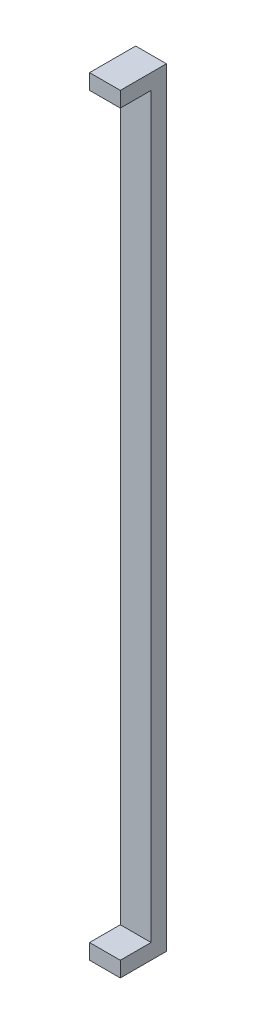
ISO-10303-21;
HEADER;
FILE_DESCRIPTION(('STEP AP214'),'2;1');
FILE_NAME('part.step','',(''),(''),'','','');
FILE_SCHEMA(('AUTOMOTIVE_DESIGN { 1 0 10303 214 1 1 1 1 }'));
ENDSEC;
DATA;
#1=APPLICATION_CONTEXT('core data for automotive mechanical design processes');
#2=APPLICATION_PROTOCOL_DEFINITION('international standard','automotive_design',2000,#1);
#3=PRODUCT_CONTEXT('',#1,'mechanical');
#4=PRODUCT('Part','Part','',(#3));
#5=PRODUCT_RELATED_PRODUCT_CATEGORY('part','',(#4));
#6=PRODUCT_DEFINITION_FORMATION('','',#4);
#7=PRODUCT_DEFINITION_CONTEXT('part definition',#1,'design');
#8=PRODUCT_DEFINITION('design','',#6,#7);
#9=PRODUCT_DEFINITION_SHAPE('','',#8);
#10=(LENGTH_UNIT() NAMED_UNIT(*) SI_UNIT(.MILLI.,.METRE.));
#11=(NAMED_UNIT(*) PLANE_ANGLE_UNIT() SI_UNIT($,.RADIAN.));
#12=(NAMED_UNIT(*) SI_UNIT($,.STERADIAN.) SOLID_ANGLE_UNIT());
#13=UNCERTAINTY_MEASURE_WITH_UNIT(LENGTH_MEASURE(1.E-05),#10,'distance_accuracy_value','');
#14=(GEOMETRIC_REPRESENTATION_CONTEXT(3) GLOBAL_UNCERTAINTY_ASSIGNED_CONTEXT((#13)) GLOBAL_UNIT_ASSIGNED_CONTEXT((#10,
#11,#12)) REPRESENTATION_CONTEXT('',''));
#15=CARTESIAN_POINT('',(0.,0.,0.));
#16=DIRECTION('',(0.,0.,1.));
#17=DIRECTION('',(1.,0.,0.));
#18=AXIS2_PLACEMENT_3D('',#15,#16,#17);
#19=CARTESIAN_POINT('',(40.,0.,0.));
#20=DIRECTION('',(0.,0.,-1.));
#21=DIRECTION('',(-1.,0.,0.));
#22=AXIS2_PLACEMENT_3D('',#19,#20,#21);
#23=PLANE('',#22);
#24=DIRECTION('',(0.,-1.,0.));
#25=VECTOR('',#24,1.);
#26=CARTESIAN_POINT('',(0.,0.,0.));
#27=LINE('',#26,#25);
#28=CARTESIAN_POINT('',(0.,20.,0.));
#29=VERTEX_POINT('',#28);
#30=CARTESIAN_POINT('',(0.,0.,0.));
#31=VERTEX_POINT('',#30);
#32=EDGE_CURVE('E129',#29,#31,#27,.T.);
#33=ORIENTED_EDGE('',*,*,#32,.T.);
#34=DIRECTION('',(-1.,0.,0.));
#35=VECTOR('',#34,1.);
#36=CARTESIAN_POINT('',(40.,0.,0.));
#37=LINE('',#36,#35);
#38=CARTESIAN_POINT('',(40.,0.,0.));
#39=VERTEX_POINT('',#38);
#40=EDGE_CURVE('E11',#39,#31,#37,.T.);
#41=ORIENTED_EDGE('',*,*,#40,.F.);
#42=DIRECTION('',(0.,-1.,0.));
#43=VECTOR('',#42,1.);
#44=CARTESIAN_POINT('',(40.,0.,0.));
#45=LINE('',#44,#43);
#46=CARTESIAN_POINT('',(40.,20.,0.));
#47=VERTEX_POINT('',#46);
#48=EDGE_CURVE('E143',#47,#39,#45,.T.);
#49=ORIENTED_EDGE('',*,*,#48,.F.);
#50=DIRECTION('',(-1.,0.,0.));
#51=VECTOR('',#50,1.);
#52=CARTESIAN_POINT('',(40.,20.,0.));
#53=LINE('',#52,#51);
#54=EDGE_CURVE('E125',#47,#29,#53,.T.);
#55=ORIENTED_EDGE('',*,*,#54,.T.);
#56=EDGE_LOOP('',(#33,#41,#49,#55));
#57=FACE_BOUND('',#56,.T.);
#58=ADVANCED_FACE('F33',(#57),#23,.F.);
#59=CARTESIAN_POINT('',(40.,0.,0.));
#60=DIRECTION('',(0.,1.,0.));
#61=DIRECTION('',(0.,0.,1.));
#62=AXIS2_PLACEMENT_3D('',#59,#60,#61);
#63=PLANE('',#62);
#64=DIRECTION('',(0.,0.,-1.));
#65=VECTOR('',#64,1.);
#66=CARTESIAN_POINT('',(0.,0.,0.));
#67=LINE('',#66,#65);
#68=CARTESIAN_POINT('',(0.,0.,-60.));
#69=VERTEX_POINT('',#68);
#70=EDGE_CURVE('E132',#31,#69,#67,.T.);
#71=ORIENTED_EDGE('',*,*,#70,.T.);
#72=DIRECTION('',(-1.,0.,0.));
#73=VECTOR('',#72,1.);
#74=CARTESIAN_POINT('',(40.,0.,-60.));
#75=LINE('',#74,#73);
#76=CARTESIAN_POINT('',(40.,0.,-60.));
#77=VERTEX_POINT('',#76);
#78=EDGE_CURVE('E41',#77,#69,#75,.T.);
#79=ORIENTED_EDGE('',*,*,#78,.F.);
#80=DIRECTION('',(0.,0.,-1.));
#81=VECTOR('',#80,1.);
#82=CARTESIAN_POINT('',(40.,0.,0.));
#83=LINE('',#82,#81);
#84=EDGE_CURVE('E92',#39,#77,#83,.T.);
#85=ORIENTED_EDGE('',*,*,#84,.F.);
#86=ORIENTED_EDGE('',*,*,#40,.T.);
#87=EDGE_LOOP('',(#71,#79,#85,#86));
#88=FACE_BOUND('',#87,.T.);
#89=ADVANCED_FACE('F178',(#88),#63,.F.);
#90=CARTESIAN_POINT('',(40.,0.,-60.));
#91=DIRECTION('',(0.,0.,1.));
#92=DIRECTION('',(1.,0.,0.));
#93=AXIS2_PLACEMENT_3D('',#90,#91,#92);
#94=PLANE('',#93);
#95=DIRECTION('',(0.,1.,0.));
#96=VECTOR('',#95,1.);
#97=CARTESIAN_POINT('',(0.,0.,-60.));
#98=LINE('',#97,#96);
#99=CARTESIAN_POINT('',(0.,1000.,-60.));
#100=VERTEX_POINT('',#99);
#101=EDGE_CURVE('E134',#69,#100,#98,.T.);
#102=ORIENTED_EDGE('',*,*,#101,.T.);
#103=DIRECTION('',(-1.,0.,0.));
#104=VECTOR('',#103,1.);
#105=CARTESIAN_POINT('',(40.,1000.,-60.));
#106=LINE('',#105,#104);
#107=CARTESIAN_POINT('',(40.,1000.,-60.));
#108=VERTEX_POINT('',#107);
#109=EDGE_CURVE('E150',#108,#100,#106,.T.);
#110=ORIENTED_EDGE('',*,*,#109,.F.);
#111=DIRECTION('',(0.,1.,0.));
#112=VECTOR('',#111,1.);
#113=CARTESIAN_POINT('',(40.,0.,-60.));
#114=LINE('',#113,#112);
#115=EDGE_CURVE('E158',#77,#108,#114,.T.);
#116=ORIENTED_EDGE('',*,*,#115,.F.);
#117=ORIENTED_EDGE('',*,*,#78,.T.);
#118=EDGE_LOOP('',(#102,#110,#116,#117));
#119=FACE_BOUND('',#118,.T.);
#120=ADVANCED_FACE('F156',(#119),#94,.F.);
#121=CARTESIAN_POINT('',(40.,1000.,-60.));
#122=DIRECTION('',(0.,-1.,0.));
#123=DIRECTION('',(0.,0.,-1.));
#124=AXIS2_PLACEMENT_3D('',#121,#122,#123);
#125=PLANE('',#124);
#126=DIRECTION('',(0.,0.,1.));
#127=VECTOR('',#126,1.);
#128=CARTESIAN_POINT('',(0.,1000.,-60.));
#129=LINE('',#128,#127);
#130=CARTESIAN_POINT('',(0.,1000.,0.));
#131=VERTEX_POINT('',#130);
#132=EDGE_CURVE('E136',#100,#131,#129,.T.);
#133=ORIENTED_EDGE('',*,*,#132,.T.);
#134=DIRECTION('',(-1.,0.,0.));
#135=VECTOR('',#134,1.);
#136=CARTESIAN_POINT('',(40.,1000.,0.));
#137=LINE('',#136,#135);
#138=CARTESIAN_POINT('',(40.,1000.,0.));
#139=VERTEX_POINT('',#138);
#140=EDGE_CURVE('E147',#139,#131,#137,.T.);
#141=ORIENTED_EDGE('',*,*,#140,.F.);
#142=DIRECTION('',(0.,0.,1.));
#143=VECTOR('',#142,1.);
#144=CARTESIAN_POINT('',(40.,1000.,-60.));
#145=LINE('',#144,#143);
#146=EDGE_CURVE('E170',#108,#139,#145,.T.);
#147=ORIENTED_EDGE('',*,*,#146,.F.);
#148=ORIENTED_EDGE('',*,*,#109,.T.);
#149=EDGE_LOOP('',(#133,#141,#147,#148));
#150=FACE_BOUND('',#149,.T.);
#151=ADVANCED_FACE('F166',(#150),#125,.F.);
#152=CARTESIAN_POINT('',(40.,980.,0.));
#153=DIRECTION('',(0.,0.,-1.));
#154=DIRECTION('',(-1.,0.,0.));
#155=AXIS2_PLACEMENT_3D('',#152,#153,#154);
#156=PLANE('',#155);
#157=DIRECTION('',(0.,-1.,0.));
#158=VECTOR('',#157,1.);
#159=CARTESIAN_POINT('',(0.,980.,0.));
#160=LINE('',#159,#158);
#161=CARTESIAN_POINT('',(0.,980.,0.));
#162=VERTEX_POINT('',#161);
#163=EDGE_CURVE('E138',#131,#162,#160,.T.);
#164=ORIENTED_EDGE('',*,*,#163,.T.);
#165=DIRECTION('',(-1.,0.,0.));
#166=VECTOR('',#165,1.);
#167=CARTESIAN_POINT('',(40.,980.,0.));
#168=LINE('',#167,#166);
#169=CARTESIAN_POINT('',(40.,980.,0.));
#170=VERTEX_POINT('',#169);
#171=EDGE_CURVE('E120',#170,#162,#168,.T.);
#172=ORIENTED_EDGE('',*,*,#171,.F.);
#173=DIRECTION('',(0.,-1.,0.));
#174=VECTOR('',#173,1.);
#175=CARTESIAN_POINT('',(40.,980.,0.));
#176=LINE('',#175,#174);
#177=EDGE_CURVE('E111',#139,#170,#176,.T.);
#178=ORIENTED_EDGE('',*,*,#177,.F.);
#179=ORIENTED_EDGE('',*,*,#140,.T.);
#180=EDGE_LOOP('',(#164,#172,#178,#179));
#181=FACE_BOUND('',#180,.T.);
#182=ADVANCED_FACE('F169',(#181),#156,.F.);
#183=CARTESIAN_POINT('',(40.,980.,-40.));
#184=DIRECTION('',(0.,1.,0.));
#185=DIRECTION('',(0.,0.,1.));
#186=AXIS2_PLACEMENT_3D('',#183,#184,#185);
#187=PLANE('',#186);
#188=DIRECTION('',(0.,0.,-1.));
#189=VECTOR('',#188,1.);
#190=CARTESIAN_POINT('',(0.,980.,-40.));
#191=LINE('',#190,#189);
#192=CARTESIAN_POINT('',(0.,980.,-40.));
#193=VERTEX_POINT('',#192);
#194=EDGE_CURVE('E119',#162,#193,#191,.T.);
#195=ORIENTED_EDGE('',*,*,#194,.T.);
#196=DIRECTION('',(-1.,0.,0.));
#197=VECTOR('',#196,1.);
#198=CARTESIAN_POINT('',(40.,980.,-40.));
#199=LINE('',#198,#197);
#200=CARTESIAN_POINT('',(40.,980.,-40.));
#201=VERTEX_POINT('',#200);
#202=EDGE_CURVE('E116',#201,#193,#199,.T.);
#203=ORIENTED_EDGE('',*,*,#202,.F.);
#204=DIRECTION('',(0.,0.,-1.));
#205=VECTOR('',#204,1.);
#206=CARTESIAN_POINT('',(40.,980.,-40.));
#207=LINE('',#206,#205);
#208=EDGE_CURVE('E105',#170,#201,#207,.T.);
#209=ORIENTED_EDGE('',*,*,#208,.F.);
#210=ORIENTED_EDGE('',*,*,#171,.T.);
#211=EDGE_LOOP('',(#195,#203,#209,#210));
#212=FACE_BOUND('',#211,.T.);
#213=ADVANCED_FACE('F117',(#212),#187,.F.);
#214=CARTESIAN_POINT('',(40.,20.,-40.));
#215=DIRECTION('',(0.,0.,-1.));
#216=DIRECTION('',(-1.,0.,0.));
#217=AXIS2_PLACEMENT_3D('',#214,#215,#216);
#218=PLANE('',#217);
#219=DIRECTION('',(0.,-1.,0.));
#220=VECTOR('',#219,1.);
#221=CARTESIAN_POINT('',(0.,20.,-40.));
#222=LINE('',#221,#220);
#223=CARTESIAN_POINT('',(0.,20.,-40.));
#224=VERTEX_POINT('',#223);
#225=EDGE_CURVE('E78',#193,#224,#222,.T.);
#226=ORIENTED_EDGE('',*,*,#225,.T.);
#227=DIRECTION('',(-1.,0.,0.));
#228=VECTOR('',#227,1.);
#229=CARTESIAN_POINT('',(40.,20.,-40.));
#230=LINE('',#229,#228);
#231=CARTESIAN_POINT('',(40.,20.,-40.));
#232=VERTEX_POINT('',#231);
#233=EDGE_CURVE('E121',#232,#224,#230,.T.);
#234=ORIENTED_EDGE('',*,*,#233,.F.);
#235=DIRECTION('',(0.,-1.,0.));
#236=VECTOR('',#235,1.);
#237=CARTESIAN_POINT('',(40.,20.,-40.));
#238=LINE('',#237,#236);
#239=EDGE_CURVE('E109',#201,#232,#238,.T.);
#240=ORIENTED_EDGE('',*,*,#239,.F.);
#241=ORIENTED_EDGE('',*,*,#202,.T.);
#242=EDGE_LOOP('',(#226,#234,#240,#241));
#243=FACE_BOUND('',#242,.T.);
#244=ADVANCED_FACE('F123',(#243),#218,.F.);
#245=CARTESIAN_POINT('',(40.,20.,0.));
#246=DIRECTION('',(0.,-1.,0.));
#247=DIRECTION('',(0.,0.,-1.));
#248=AXIS2_PLACEMENT_3D('',#245,#246,#247);
#249=PLANE('',#248);
#250=DIRECTION('',(0.,0.,1.));
#251=VECTOR('',#250,1.);
#252=CARTESIAN_POINT('',(0.,20.,0.));
#253=LINE('',#252,#251);
#254=EDGE_CURVE('E84',#224,#29,#253,.T.);
#255=ORIENTED_EDGE('',*,*,#254,.T.);
#256=ORIENTED_EDGE('',*,*,#54,.F.);
#257=DIRECTION('',(0.,0.,1.));
#258=VECTOR('',#257,1.);
#259=CARTESIAN_POINT('',(40.,20.,0.));
#260=LINE('',#259,#258);
#261=EDGE_CURVE('E49',#232,#47,#260,.T.);
#262=ORIENTED_EDGE('',*,*,#261,.F.);
#263=ORIENTED_EDGE('',*,*,#233,.T.);
#264=EDGE_LOOP('',(#255,#256,#262,#263));
#265=FACE_BOUND('',#264,.T.);
#266=ADVANCED_FACE('F194',(#265),#249,.F.);
#267=CARTESIAN_POINT('',(40.,0.,0.));
#268=DIRECTION('',(-1.,0.,0.));
#269=DIRECTION('',(0.,0.,1.));
#270=AXIS2_PLACEMENT_3D('',#267,#268,#269);
#271=PLANE('',#270);
#272=ORIENTED_EDGE('',*,*,#48,.T.);
#273=ORIENTED_EDGE('',*,*,#84,.T.);
#274=ORIENTED_EDGE('',*,*,#115,.T.);
#275=ORIENTED_EDGE('',*,*,#146,.T.);
#276=ORIENTED_EDGE('',*,*,#177,.T.);
#277=ORIENTED_EDGE('',*,*,#208,.T.);
#278=ORIENTED_EDGE('',*,*,#239,.T.);
#279=ORIENTED_EDGE('',*,*,#261,.T.);
#280=EDGE_LOOP('',(#272,#273,#274,#275,#276,#277,#278,#279));
#281=FACE_BOUND('',#280,.T.);
#282=ADVANCED_FACE('F107',(#281),#271,.F.);
#283=CARTESIAN_POINT('',(0.,0.,0.));
#284=DIRECTION('',(-1.,0.,0.));
#285=DIRECTION('',(0.,0.,1.));
#286=AXIS2_PLACEMENT_3D('',#283,#284,#285);
#287=PLANE('',#286);
#288=ORIENTED_EDGE('',*,*,#32,.F.);
#289=ORIENTED_EDGE('',*,*,#254,.F.);
#290=ORIENTED_EDGE('',*,*,#225,.F.);
#291=ORIENTED_EDGE('',*,*,#194,.F.);
#292=ORIENTED_EDGE('',*,*,#163,.F.);
#293=ORIENTED_EDGE('',*,*,#132,.F.);
#294=ORIENTED_EDGE('',*,*,#101,.F.);
#295=ORIENTED_EDGE('',*,*,#70,.F.);
#296=EDGE_LOOP('',(#288,#289,#290,#291,#292,#293,#294,#295));
#297=FACE_BOUND('',#296,.T.);
#298=ADVANCED_FACE('F162',(#297),#287,.T.);
#299=CLOSED_SHELL('',(#58,#89,#120,#151,#182,#213,#244,#266,#282,#298));
#300=MANIFOLD_SOLID_BREP('B2',#299);
#301=ADVANCED_BREP_SHAPE_REPRESENTATION('',(#18,#300),#14);
#302=SHAPE_DEFINITION_REPRESENTATION(#9,#301);
ENDSEC;
END-ISO-10303-21;
